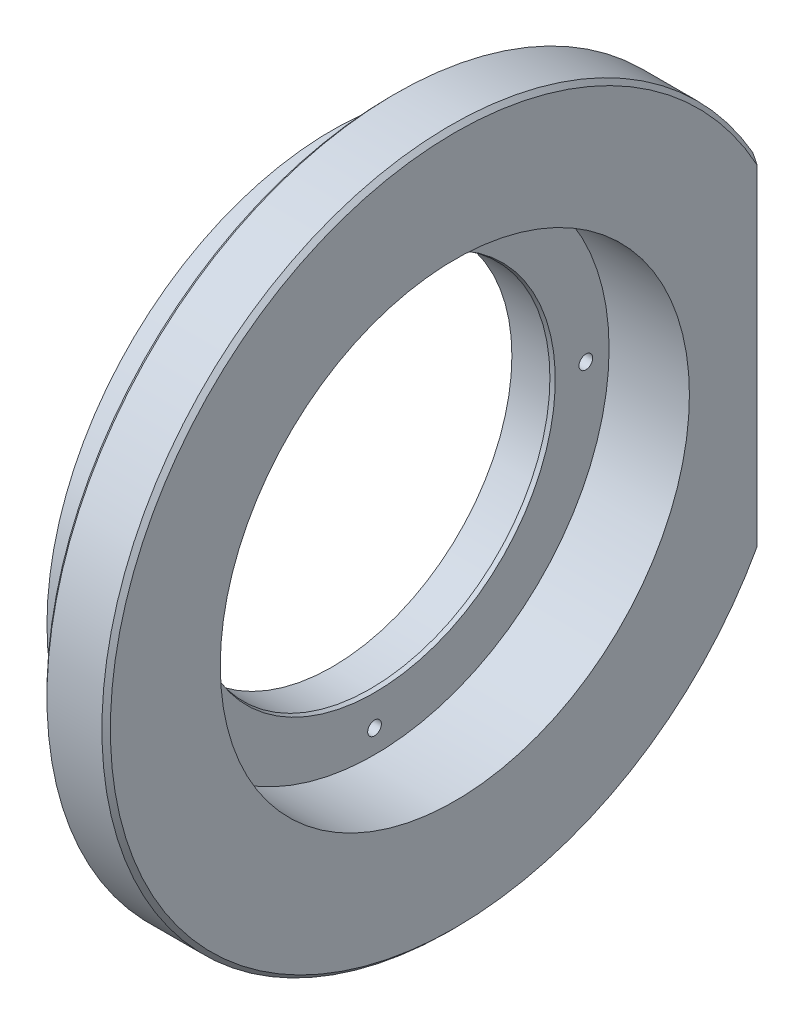
ISO-10303-21;
HEADER;
FILE_DESCRIPTION(('STEP AP214'),'2;1');
FILE_NAME('part.step','',(''),(''),'','','');
FILE_SCHEMA(('AUTOMOTIVE_DESIGN { 1 0 10303 214 1 1 1 1 }'));
ENDSEC;
DATA;
#1=APPLICATION_CONTEXT('core data for automotive mechanical design processes');
#2=APPLICATION_PROTOCOL_DEFINITION('international standard','automotive_design',2000,#1);
#3=PRODUCT_CONTEXT('',#1,'mechanical');
#4=PRODUCT('Part','Part','',(#3));
#5=PRODUCT_RELATED_PRODUCT_CATEGORY('part','',(#4));
#6=PRODUCT_DEFINITION_FORMATION('','',#4);
#7=PRODUCT_DEFINITION_CONTEXT('part definition',#1,'design');
#8=PRODUCT_DEFINITION('design','',#6,#7);
#9=PRODUCT_DEFINITION_SHAPE('','',#8);
#10=(LENGTH_UNIT() NAMED_UNIT(*) SI_UNIT(.MILLI.,.METRE.));
#11=(NAMED_UNIT(*) PLANE_ANGLE_UNIT() SI_UNIT($,.RADIAN.));
#12=(NAMED_UNIT(*) SI_UNIT($,.STERADIAN.) SOLID_ANGLE_UNIT());
#13=UNCERTAINTY_MEASURE_WITH_UNIT(LENGTH_MEASURE(1.E-05),#10,'distance_accuracy_value','');
#14=(GEOMETRIC_REPRESENTATION_CONTEXT(3) GLOBAL_UNCERTAINTY_ASSIGNED_CONTEXT((#13)) GLOBAL_UNIT_ASSIGNED_CONTEXT((#10,
#11,#12)) REPRESENTATION_CONTEXT('',''));
#15=CARTESIAN_POINT('',(0.,0.,0.));
#16=DIRECTION('',(0.,0.,1.));
#17=DIRECTION('',(1.,0.,0.));
#18=AXIS2_PLACEMENT_3D('',#15,#16,#17);
#19=CARTESIAN_POINT('',(140.,0.,0.));
#20=DIRECTION('',(-1.,0.,0.));
#21=DIRECTION('',(0.,0.,1.));
#22=AXIS2_PLACEMENT_3D('',#19,#20,#21);
#23=CYLINDRICAL_SURFACE('',#22,82.5);
#24=DIRECTION('',(-1.,0.,0.));
#25=VECTOR('',#24,1.);
#26=CARTESIAN_POINT('',(140.,-41.1582312545134,-71.5));
#27=LINE('',#26,#25);
#28=CARTESIAN_POINT('',(138.999999999102,-41.1582312545134,-71.5));
#29=VERTEX_POINT('',#28);
#30=CARTESIAN_POINT('',(125.999999999103,-41.1582312545134,-71.5));
#31=VERTEX_POINT('',#30);
#32=EDGE_CURVE('E147',#29,#31,#27,.T.);
#33=ORIENTED_EDGE('',*,*,#32,.F.);
#34=CARTESIAN_POINT('',(138.999999999102,0.,0.));
#35=DIRECTION('',(-1.,0.,0.));
#36=DIRECTION('',(0.,0.,1.));
#37=AXIS2_PLACEMENT_3D('',#34,#35,#36);
#38=CIRCLE('',#37,82.5);
#39=CARTESIAN_POINT('',(138.999999999102,41.1582312545134,-71.5));
#40=VERTEX_POINT('',#39);
#41=EDGE_CURVE('E154',#29,#40,#38,.T.);
#42=ORIENTED_EDGE('',*,*,#41,.T.);
#43=DIRECTION('',(-1.,0.,0.));
#44=VECTOR('',#43,1.);
#45=CARTESIAN_POINT('',(140.,41.1582312545134,-71.5));
#46=LINE('',#45,#44);
#47=CARTESIAN_POINT('',(125.999999999103,41.1582312545134,-71.5));
#48=VERTEX_POINT('',#47);
#49=EDGE_CURVE('E144',#40,#48,#46,.T.);
#50=ORIENTED_EDGE('',*,*,#49,.T.);
#51=CARTESIAN_POINT('',(125.999999999103,0.,0.));
#52=DIRECTION('',(-1.,0.,0.));
#53=DIRECTION('',(0.,0.,1.));
#54=AXIS2_PLACEMENT_3D('',#51,#52,#53);
#55=CIRCLE('',#54,82.5);
#56=EDGE_CURVE('E150',#48,#31,#55,.F.);
#57=ORIENTED_EDGE('',*,*,#56,.T.);
#58=EDGE_LOOP('',(#33,#42,#50,#57));
#59=FACE_BOUND('',#58,.T.);
#60=ADVANCED_FACE('F41',(#59),#23,.T.);
#61=CARTESIAN_POINT('',(140.,41.1582312545134,-71.5));
#62=DIRECTION('',(0.,0.,-1.));
#63=DIRECTION('',(-1.,0.,0.));
#64=AXIS2_PLACEMENT_3D('',#61,#62,#63);
#65=PLANE('',#64);
#66=ORIENTED_EDGE('',*,*,#49,.F.);
#67=CARTESIAN_POINT('',(138.999999999102,41.1582312545134,-71.5));
#68=CARTESIAN_POINT('',(139.169268794538,40.8190021582209,-71.5));
#69=CARTESIAN_POINT('',(139.33723651836,40.4791362235033,-71.5));
#70=CARTESIAN_POINT('',(139.670569852456,39.7981306165875,-71.5));
#71=CARTESIAN_POINT('',(139.835935462266,39.4569909441626,-71.5));
#72=CARTESIAN_POINT('',(140.,39.1152144330857,-71.5));
#73=B_SPLINE_CURVE_WITH_KNOTS('',3,(#67,#68,#69,#70,#71,#72),.UNSPECIFIED.,.F.,.F.,(4,2,4),(0.,
1.137320574178,2.27464135086772),.UNSPECIFIED.);
#74=CARTESIAN_POINT('',(140.,39.1152144330857,-71.5));
#75=VERTEX_POINT('',#74);
#76=EDGE_CURVE('E63',#40,#75,#73,.T.);
#77=ORIENTED_EDGE('',*,*,#76,.T.);
#78=DIRECTION('',(0.,-1.,0.));
#79=VECTOR('',#78,1.);
#80=CARTESIAN_POINT('',(140.,41.1582312545134,-71.5));
#81=LINE('',#80,#79);
#82=CARTESIAN_POINT('',(140.,-39.1152144330857,-71.5));
#83=VERTEX_POINT('',#82);
#84=EDGE_CURVE('E142',#75,#83,#81,.T.);
#85=ORIENTED_EDGE('',*,*,#84,.T.);
#86=CARTESIAN_POINT('',(140.,-39.1152144330857,-71.5));
#87=CARTESIAN_POINT('',(139.835935462266,-39.4569909441626,-71.5));
#88=CARTESIAN_POINT('',(139.670569852456,-39.7981306165875,-71.5));
#89=CARTESIAN_POINT('',(139.33723651836,-40.4791362235033,-71.5));
#90=CARTESIAN_POINT('',(139.169268794538,-40.8190021582209,-71.5));
#91=CARTESIAN_POINT('',(138.999999999102,-41.1582312545134,-71.5));
#92=B_SPLINE_CURVE_WITH_KNOTS('',3,(#86,#87,#88,#89,#90,#91),.UNSPECIFIED.,.F.,.F.,(4,2,4),(0.,
1.13732077668972,2.27464135086772),.UNSPECIFIED.);
#93=EDGE_CURVE('E191',#83,#29,#92,.T.);
#94=ORIENTED_EDGE('',*,*,#93,.T.);
#95=ORIENTED_EDGE('',*,*,#32,.T.);
#96=CARTESIAN_POINT('',(125.999999999103,-41.1582312545134,-71.5));
#97=CARTESIAN_POINT('',(125.830731203962,-40.819002157595,-71.5));
#98=CARTESIAN_POINT('',(125.662763480437,-40.4791362222527,-71.5));
#99=CARTESIAN_POINT('',(125.329430146939,-39.7981306140904,-71.5));
#100=CARTESIAN_POINT('',(125.164064537431,-39.4569909410435,-71.5));
#101=CARTESIAN_POINT('',(125.,-39.115214429346,-71.5));
#102=B_SPLINE_CURVE_WITH_KNOTS('',3,(#96,#97,#98,#99,#100,#101),.UNSPECIFIED.,.F.,.F.,(4,2,4),
(0.,1.13732057546287,2.27464135343747),.UNSPECIFIED.);
#103=CARTESIAN_POINT('',(125.,-39.115214429346,-71.5));
#104=VERTEX_POINT('',#103);
#105=EDGE_CURVE('E157',#31,#104,#102,.T.);
#106=ORIENTED_EDGE('',*,*,#105,.T.);
#107=DIRECTION('',(0.,-1.,0.));
#108=VECTOR('',#107,1.);
#109=CARTESIAN_POINT('',(125.,41.1582312545134,-71.5));
#110=LINE('',#109,#108);
#111=CARTESIAN_POINT('',(125.,39.115214429346,-71.5));
#112=VERTEX_POINT('',#111);
#113=EDGE_CURVE('E141',#112,#104,#110,.T.);
#114=ORIENTED_EDGE('',*,*,#113,.F.);
#115=CARTESIAN_POINT('',(125.,39.115214429346,-71.5));
#116=CARTESIAN_POINT('',(125.164064537431,39.4569909410435,-71.5));
#117=CARTESIAN_POINT('',(125.329430146939,39.7981306140904,-71.5));
#118=CARTESIAN_POINT('',(125.662763480437,40.4791362222527,-71.5));
#119=CARTESIAN_POINT('',(125.830731203962,40.819002157595,-71.5));
#120=CARTESIAN_POINT('',(125.999999999103,41.1582312545134,-71.5));
#121=B_SPLINE_CURVE_WITH_KNOTS('',3,(#115,#116,#117,#118,#119,#120),.UNSPECIFIED.,.F.,.F.,(4,2,
4),(0.,1.13732077797459,2.27464135343747),.UNSPECIFIED.);
#122=EDGE_CURVE('E164',#112,#48,#121,.T.);
#123=ORIENTED_EDGE('',*,*,#122,.T.);
#124=EDGE_LOOP('',(#66,#77,#85,#94,#95,#106,#114,#123));
#125=FACE_BOUND('',#124,.T.);
#126=ADVANCED_FACE('F170',(#125),#65,.T.);
#127=CARTESIAN_POINT('',(140.,0.,0.));
#128=DIRECTION('',(-1.,0.,0.));
#129=DIRECTION('',(0.,0.,1.));
#130=AXIS2_PLACEMENT_3D('',#127,#128,#129);
#131=PLANE('',#130);
#132=CARTESIAN_POINT('',(140.,0.,0.));
#133=DIRECTION('',(1.,0.,0.));
#134=DIRECTION('',(0.,0.,-1.));
#135=AXIS2_PLACEMENT_3D('',#132,#133,#134);
#136=CIRCLE('',#135,55.5);
#137=CARTESIAN_POINT('',(140.,0.,-55.5));
#138=VERTEX_POINT('',#137);
#139=EDGE_CURVE('E126',#138,#138,#136,.T.);
#140=ORIENTED_EDGE('',*,*,#139,.F.);
#141=EDGE_LOOP('',(#140));
#142=FACE_BOUND('',#141,.T.);
#143=ORIENTED_EDGE('',*,*,#84,.F.);
#144=CARTESIAN_POINT('',(140.,0.,0.));
#145=DIRECTION('',(-1.,0.,0.));
#146=DIRECTION('',(0.,0.,1.));
#147=AXIS2_PLACEMENT_3D('',#144,#145,#146);
#148=CIRCLE('',#147,81.5000000008974);
#149=EDGE_CURVE('E56',#75,#83,#148,.F.);
#150=ORIENTED_EDGE('',*,*,#149,.T.);
#151=EDGE_LOOP('',(#143,#150));
#152=FACE_BOUND('',#151,.T.);
#153=ADVANCED_FACE('F221',(#142,#152),#131,.F.);
#154=CARTESIAN_POINT('',(125.,0.,0.));
#155=DIRECTION('',(-1.,0.,0.));
#156=DIRECTION('',(0.,0.,1.));
#157=AXIS2_PLACEMENT_3D('',#154,#155,#156);
#158=PLANE('',#157);
#159=CARTESIAN_POINT('',(125.,0.,0.));
#160=DIRECTION('',(1.,0.,0.));
#161=DIRECTION('',(0.,0.,-1.));
#162=AXIS2_PLACEMENT_3D('',#159,#160,#161);
#163=CIRCLE('',#162,67.5);
#164=CARTESIAN_POINT('',(125.,0.,-67.5));
#165=VERTEX_POINT('',#164);
#166=EDGE_CURVE('E135',#165,#165,#163,.T.);
#167=ORIENTED_EDGE('',*,*,#166,.T.);
#168=EDGE_LOOP('',(#167));
#169=FACE_BOUND('',#168,.T.);
#170=ORIENTED_EDGE('',*,*,#113,.T.);
#171=CARTESIAN_POINT('',(125.,0.,0.));
#172=DIRECTION('',(-1.,0.,0.));
#173=DIRECTION('',(0.,0.,1.));
#174=AXIS2_PLACEMENT_3D('',#171,#172,#173);
#175=CIRCLE('',#174,81.4999999991026);
#176=EDGE_CURVE('E203',#104,#112,#175,.T.);
#177=ORIENTED_EDGE('',*,*,#176,.T.);
#178=EDGE_LOOP('',(#170,#177));
#179=FACE_BOUND('',#178,.T.);
#180=ADVANCED_FACE('F230',(#169,#179),#158,.T.);
#181=CARTESIAN_POINT('',(111.,0.,0.));
#182=DIRECTION('',(1.,0.,0.));
#183=DIRECTION('',(0.,0.,-1.));
#184=AXIS2_PLACEMENT_3D('',#181,#182,#183);
#185=CYLINDRICAL_SURFACE('',#184,67.5);
#186=CARTESIAN_POINT('',(111.,0.,0.));
#187=DIRECTION('',(1.,0.,0.));
#188=DIRECTION('',(0.,0.,-1.));
#189=AXIS2_PLACEMENT_3D('',#186,#187,#188);
#190=CIRCLE('',#189,67.5);
#191=CARTESIAN_POINT('',(111.,0.,-67.5));
#192=VERTEX_POINT('',#191);
#193=EDGE_CURVE('E138',#192,#192,#190,.T.);
#194=ORIENTED_EDGE('',*,*,#193,.T.);
#195=EDGE_LOOP('',(#194));
#196=FACE_BOUND('',#195,.T.);
#197=ORIENTED_EDGE('',*,*,#166,.F.);
#198=EDGE_LOOP('',(#197));
#199=FACE_BOUND('',#198,.T.);
#200=ADVANCED_FACE('F232',(#196,#199),#185,.T.);
#201=CARTESIAN_POINT('',(111.,67.5,0.));
#202=DIRECTION('',(-1.,0.,0.));
#203=DIRECTION('',(0.,0.,1.));
#204=AXIS2_PLACEMENT_3D('',#201,#202,#203);
#205=PLANE('',#204);
#206=CARTESIAN_POINT('',(111.,0.,0.));
#207=DIRECTION('',(1.,0.,0.));
#208=DIRECTION('',(0.,0.,-1.));
#209=AXIS2_PLACEMENT_3D('',#206,#207,#208);
#210=CIRCLE('',#209,42.5);
#211=CARTESIAN_POINT('',(111.,0.,-42.5));
#212=VERTEX_POINT('',#211);
#213=EDGE_CURVE('E132',#212,#212,#210,.T.);
#214=ORIENTED_EDGE('',*,*,#213,.T.);
#215=EDGE_LOOP('',(#214));
#216=FACE_BOUND('',#215,.T.);
#217=ORIENTED_EDGE('',*,*,#193,.F.);
#218=EDGE_LOOP('',(#217));
#219=FACE_BOUND('',#218,.T.);
#220=ADVANCED_FACE('F238',(#216,#219),#205,.T.);
#221=CARTESIAN_POINT('',(140.,0.,0.));
#222=DIRECTION('',(1.,0.,0.));
#223=DIRECTION('',(0.,0.,-1.));
#224=AXIS2_PLACEMENT_3D('',#221,#222,#223);
#225=CYLINDRICAL_SURFACE('',#224,42.5);
#226=CARTESIAN_POINT('',(119.99999999992,0.,0.));
#227=DIRECTION('',(-1.,0.,0.));
#228=DIRECTION('',(0.,0.,1.));
#229=AXIS2_PLACEMENT_3D('',#226,#227,#228);
#230=CIRCLE('',#229,42.5);
#231=CARTESIAN_POINT('',(119.99999999992,0.,42.5));
#232=VERTEX_POINT('',#231);
#233=EDGE_CURVE('E50',#232,#232,#230,.F.);
#234=ORIENTED_EDGE('',*,*,#233,.T.);
#235=EDGE_LOOP('',(#234));
#236=FACE_BOUND('',#235,.T.);
#237=ORIENTED_EDGE('',*,*,#213,.F.);
#238=EDGE_LOOP('',(#237));
#239=FACE_BOUND('',#238,.T.);
#240=ADVANCED_FACE('F208',(#236,#239),#225,.F.);
#241=CARTESIAN_POINT('',(121.,42.5,0.));
#242=DIRECTION('',(-1.,0.,0.));
#243=DIRECTION('',(0.,0.,1.));
#244=AXIS2_PLACEMENT_3D('',#241,#242,#243);
#245=PLANE('',#244);
#246=CARTESIAN_POINT('',(121.,0.,0.));
#247=DIRECTION('',(-1.,0.,0.));
#248=DIRECTION('',(0.,0.,1.));
#249=AXIS2_PLACEMENT_3D('',#246,#247,#248);
#250=CIRCLE('',#249,42.767949192132);
#251=CARTESIAN_POINT('',(121.,0.,42.767949192132));
#252=VERTEX_POINT('',#251);
#253=EDGE_CURVE('E11',#252,#252,#250,.T.);
#254=ORIENTED_EDGE('',*,*,#253,.T.);
#255=EDGE_LOOP('',(#254));
#256=FACE_BOUND('',#255,.T.);
#257=CARTESIAN_POINT('',(121.,50.,0.));
#258=DIRECTION('',(1.,0.,0.));
#259=DIRECTION('',(0.,0.,-1.));
#260=AXIS2_PLACEMENT_3D('',#257,#258,#259);
#261=CIRCLE('',#260,1.621);
#262=CARTESIAN_POINT('',(121.,50.,-1.621));
#263=VERTEX_POINT('',#262);
#264=EDGE_CURVE('E104',#263,#263,#261,.T.);
#265=ORIENTED_EDGE('',*,*,#264,.F.);
#266=EDGE_LOOP('',(#265));
#267=FACE_BOUND('',#266,.T.);
#268=CARTESIAN_POINT('',(121.,0.,50.));
#269=DIRECTION('',(1.,0.,0.));
#270=DIRECTION('',(0.,0.,-1.));
#271=AXIS2_PLACEMENT_3D('',#268,#269,#270);
#272=CIRCLE('',#271,1.621);
#273=CARTESIAN_POINT('',(121.,0.,48.379));
#274=VERTEX_POINT('',#273);
#275=EDGE_CURVE('E103',#274,#274,#272,.T.);
#276=ORIENTED_EDGE('',*,*,#275,.F.);
#277=EDGE_LOOP('',(#276));
#278=FACE_BOUND('',#277,.T.);
#279=CARTESIAN_POINT('',(121.,-50.,0.));
#280=DIRECTION('',(1.,0.,0.));
#281=DIRECTION('',(0.,0.,-1.));
#282=AXIS2_PLACEMENT_3D('',#279,#280,#281);
#283=CIRCLE('',#282,1.621);
#284=CARTESIAN_POINT('',(121.,-50.,-1.62099999999999));
#285=VERTEX_POINT('',#284);
#286=EDGE_CURVE('E114',#285,#285,#283,.T.);
#287=ORIENTED_EDGE('',*,*,#286,.F.);
#288=EDGE_LOOP('',(#287));
#289=FACE_BOUND('',#288,.T.);
#290=CARTESIAN_POINT('',(121.,0.,-50.));
#291=DIRECTION('',(1.,0.,0.));
#292=DIRECTION('',(0.,0.,-1.));
#293=AXIS2_PLACEMENT_3D('',#290,#291,#292);
#294=CIRCLE('',#293,1.621);
#295=CARTESIAN_POINT('',(121.,0.,-51.621));
#296=VERTEX_POINT('',#295);
#297=EDGE_CURVE('E120',#296,#296,#294,.T.);
#298=ORIENTED_EDGE('',*,*,#297,.F.);
#299=EDGE_LOOP('',(#298));
#300=FACE_BOUND('',#299,.T.);
#301=CARTESIAN_POINT('',(121.,0.,0.));
#302=DIRECTION('',(1.,0.,0.));
#303=DIRECTION('',(0.,0.,-1.));
#304=AXIS2_PLACEMENT_3D('',#301,#302,#303);
#305=CIRCLE('',#304,55.5);
#306=CARTESIAN_POINT('',(121.,0.,-55.5));
#307=VERTEX_POINT('',#306);
#308=EDGE_CURVE('E129',#307,#307,#305,.T.);
#309=ORIENTED_EDGE('',*,*,#308,.T.);
#310=EDGE_LOOP('',(#309));
#311=FACE_BOUND('',#310,.T.);
#312=ADVANCED_FACE('F249',(#256,#267,#278,#289,#300,#311),#245,.F.);
#313=CARTESIAN_POINT('',(140.,0.,0.));
#314=DIRECTION('',(1.,0.,0.));
#315=DIRECTION('',(0.,0.,-1.));
#316=AXIS2_PLACEMENT_3D('',#313,#314,#315);
#317=CYLINDRICAL_SURFACE('',#316,55.5);
#318=ORIENTED_EDGE('',*,*,#308,.F.);
#319=EDGE_LOOP('',(#318));
#320=FACE_BOUND('',#319,.T.);
#321=ORIENTED_EDGE('',*,*,#139,.T.);
#322=EDGE_LOOP('',(#321));
#323=FACE_BOUND('',#322,.T.);
#324=ADVANCED_FACE('F252',(#320,#323),#317,.F.);
#325=CARTESIAN_POINT('',(113.,0.,-50.));
#326=DIRECTION('',(1.,0.,0.));
#327=DIRECTION('',(0.,0.,-1.));
#328=AXIS2_PLACEMENT_3D('',#325,#326,#327);
#329=CONICAL_SURFACE('',#328,1.621,1.02974425747175);
#330=CARTESIAN_POINT('',(112.026004933898,0.,-50.));
#331=VERTEX_POINT('',#330);
#332=VERTEX_LOOP('',#331);
#333=FACE_BOUND('',#332,.T.);
#334=CARTESIAN_POINT('',(113.,0.,-50.));
#335=DIRECTION('',(1.,0.,0.));
#336=DIRECTION('',(0.,0.,-1.));
#337=AXIS2_PLACEMENT_3D('',#334,#335,#336);
#338=CIRCLE('',#337,1.621);
#339=CARTESIAN_POINT('',(113.,0.,-51.621));
#340=VERTEX_POINT('',#339);
#341=EDGE_CURVE('E123',#340,#340,#338,.T.);
#342=ORIENTED_EDGE('',*,*,#341,.T.);
#343=EDGE_LOOP('',(#342));
#344=FACE_BOUND('',#343,.T.);
#345=ADVANCED_FACE('F256',(#333,#344),#329,.F.);
#346=CARTESIAN_POINT('',(121.,0.,-50.));
#347=DIRECTION('',(1.,0.,0.));
#348=DIRECTION('',(0.,0.,-1.));
#349=AXIS2_PLACEMENT_3D('',#346,#347,#348);
#350=CYLINDRICAL_SURFACE('',#349,1.621);
#351=ORIENTED_EDGE('',*,*,#341,.F.);
#352=EDGE_LOOP('',(#351));
#353=FACE_BOUND('',#352,.T.);
#354=ORIENTED_EDGE('',*,*,#297,.T.);
#355=EDGE_LOOP('',(#354));
#356=FACE_BOUND('',#355,.T.);
#357=ADVANCED_FACE('F260',(#353,#356),#350,.F.);
#358=CARTESIAN_POINT('',(113.,-50.,0.));
#359=DIRECTION('',(1.,0.,0.));
#360=DIRECTION('',(0.,0.,-1.));
#361=AXIS2_PLACEMENT_3D('',#358,#359,#360);
#362=CONICAL_SURFACE('',#361,1.621,1.02974425747175);
#363=CARTESIAN_POINT('',(112.026004933898,-50.,0.));
#364=VERTEX_POINT('',#363);
#365=VERTEX_LOOP('',#364);
#366=FACE_BOUND('',#365,.T.);
#367=CARTESIAN_POINT('',(113.,-50.,0.));
#368=DIRECTION('',(1.,0.,0.));
#369=DIRECTION('',(0.,0.,-1.));
#370=AXIS2_PLACEMENT_3D('',#367,#368,#369);
#371=CIRCLE('',#370,1.621);
#372=CARTESIAN_POINT('',(113.,-50.,-1.62099999999999));
#373=VERTEX_POINT('',#372);
#374=EDGE_CURVE('E117',#373,#373,#371,.T.);
#375=ORIENTED_EDGE('',*,*,#374,.T.);
#376=EDGE_LOOP('',(#375));
#377=FACE_BOUND('',#376,.T.);
#378=ADVANCED_FACE('F264',(#366,#377),#362,.F.);
#379=CARTESIAN_POINT('',(121.,-50.,0.));
#380=DIRECTION('',(1.,0.,0.));
#381=DIRECTION('',(0.,0.,-1.));
#382=AXIS2_PLACEMENT_3D('',#379,#380,#381);
#383=CYLINDRICAL_SURFACE('',#382,1.621);
#384=ORIENTED_EDGE('',*,*,#374,.F.);
#385=EDGE_LOOP('',(#384));
#386=FACE_BOUND('',#385,.T.);
#387=ORIENTED_EDGE('',*,*,#286,.T.);
#388=EDGE_LOOP('',(#387));
#389=FACE_BOUND('',#388,.T.);
#390=ADVANCED_FACE('F268',(#386,#389),#383,.F.);
#391=CARTESIAN_POINT('',(113.,0.,50.));
#392=DIRECTION('',(1.,0.,0.));
#393=DIRECTION('',(0.,0.,-1.));
#394=AXIS2_PLACEMENT_3D('',#391,#392,#393);
#395=CONICAL_SURFACE('',#394,1.621,1.02974425747175);
#396=CARTESIAN_POINT('',(112.026004933898,0.,50.));
#397=VERTEX_POINT('',#396);
#398=VERTEX_LOOP('',#397);
#399=FACE_BOUND('',#398,.T.);
#400=CARTESIAN_POINT('',(113.,0.,50.));
#401=DIRECTION('',(1.,0.,0.));
#402=DIRECTION('',(0.,0.,-1.));
#403=AXIS2_PLACEMENT_3D('',#400,#401,#402);
#404=CIRCLE('',#403,1.621);
#405=CARTESIAN_POINT('',(113.,0.,48.379));
#406=VERTEX_POINT('',#405);
#407=EDGE_CURVE('E107',#406,#406,#404,.T.);
#408=ORIENTED_EDGE('',*,*,#407,.T.);
#409=EDGE_LOOP('',(#408));
#410=FACE_BOUND('',#409,.T.);
#411=ADVANCED_FACE('F272',(#399,#410),#395,.F.);
#412=CARTESIAN_POINT('',(121.,0.,50.));
#413=DIRECTION('',(1.,0.,0.));
#414=DIRECTION('',(0.,0.,-1.));
#415=AXIS2_PLACEMENT_3D('',#412,#413,#414);
#416=CYLINDRICAL_SURFACE('',#415,1.621);
#417=ORIENTED_EDGE('',*,*,#407,.F.);
#418=EDGE_LOOP('',(#417));
#419=FACE_BOUND('',#418,.T.);
#420=ORIENTED_EDGE('',*,*,#275,.T.);
#421=EDGE_LOOP('',(#420));
#422=FACE_BOUND('',#421,.T.);
#423=ADVANCED_FACE('F97',(#419,#422),#416,.F.);
#424=CARTESIAN_POINT('',(113.,50.,0.));
#425=DIRECTION('',(1.,0.,0.));
#426=DIRECTION('',(0.,0.,-1.));
#427=AXIS2_PLACEMENT_3D('',#424,#425,#426);
#428=CONICAL_SURFACE('',#427,1.621,1.02974425747175);
#429=CARTESIAN_POINT('',(112.026004933898,50.,0.));
#430=VERTEX_POINT('',#429);
#431=VERTEX_LOOP('',#430);
#432=FACE_BOUND('',#431,.T.);
#433=CARTESIAN_POINT('',(113.,50.,0.));
#434=DIRECTION('',(1.,0.,0.));
#435=DIRECTION('',(0.,0.,-1.));
#436=AXIS2_PLACEMENT_3D('',#433,#434,#435);
#437=CIRCLE('',#436,1.621);
#438=CARTESIAN_POINT('',(113.,50.,-1.621));
#439=VERTEX_POINT('',#438);
#440=EDGE_CURVE('E101',#439,#439,#437,.T.);
#441=ORIENTED_EDGE('',*,*,#440,.T.);
#442=EDGE_LOOP('',(#441));
#443=FACE_BOUND('',#442,.T.);
#444=ADVANCED_FACE('F93',(#432,#443),#428,.F.);
#445=CARTESIAN_POINT('',(121.,50.,0.));
#446=DIRECTION('',(1.,0.,0.));
#447=DIRECTION('',(0.,0.,-1.));
#448=AXIS2_PLACEMENT_3D('',#445,#446,#447);
#449=CYLINDRICAL_SURFACE('',#448,1.621);
#450=ORIENTED_EDGE('',*,*,#440,.F.);
#451=EDGE_LOOP('',(#450));
#452=FACE_BOUND('',#451,.T.);
#453=ORIENTED_EDGE('',*,*,#264,.T.);
#454=EDGE_LOOP('',(#453));
#455=FACE_BOUND('',#454,.T.);
#456=ADVANCED_FACE('F96',(#452,#455),#449,.F.);
#457=CARTESIAN_POINT('',(138.999999999102,0.,0.));
#458=DIRECTION('',(-1.,0.,0.));
#459=DIRECTION('',(0.,0.,1.));
#460=AXIS2_PLACEMENT_3D('',#457,#458,#459);
#461=CONICAL_SURFACE('',#460,82.5,0.785398162500013);
#462=ORIENTED_EDGE('',*,*,#93,.F.);
#463=ORIENTED_EDGE('',*,*,#149,.F.);
#464=ORIENTED_EDGE('',*,*,#76,.F.);
#465=ORIENTED_EDGE('',*,*,#41,.F.);
#466=EDGE_LOOP('',(#462,#463,#464,#465));
#467=FACE_BOUND('',#466,.T.);
#468=ADVANCED_FACE('F182',(#467),#461,.T.);
#469=CARTESIAN_POINT('',(125.,0.,0.));
#470=DIRECTION('',(1.,0.,0.));
#471=DIRECTION('',(0.,0.,-1.));
#472=AXIS2_PLACEMENT_3D('',#469,#470,#471);
#473=CONICAL_SURFACE('',#472,81.4999999991026,0.785398164294876);
#474=ORIENTED_EDGE('',*,*,#105,.F.);
#475=ORIENTED_EDGE('',*,*,#56,.F.);
#476=ORIENTED_EDGE('',*,*,#122,.F.);
#477=ORIENTED_EDGE('',*,*,#176,.F.);
#478=EDGE_LOOP('',(#474,#475,#476,#477));
#479=FACE_BOUND('',#478,.T.);
#480=ADVANCED_FACE('F175',(#479),#473,.T.);
#481=CARTESIAN_POINT('',(119.99999999992,0.,0.));
#482=DIRECTION('',(1.,0.,0.));
#483=DIRECTION('',(0.,0.,-1.));
#484=AXIS2_PLACEMENT_3D('',#481,#482,#483);
#485=CONICAL_SURFACE('',#484,42.5,0.261799387500021);
#486=ORIENTED_EDGE('',*,*,#253,.F.);
#487=EDGE_LOOP('',(#486));
#488=FACE_BOUND('',#487,.T.);
#489=ORIENTED_EDGE('',*,*,#233,.F.);
#490=EDGE_LOOP('',(#489));
#491=FACE_BOUND('',#490,.T.);
#492=ADVANCED_FACE('F44',(#488,#491),#485,.F.);
#493=CLOSED_SHELL('',(#60,#126,#153,#180,#200,#220,#240,#312,#324,#345,#357,#378,#390,#411,#423,
#444,#456,#468,#480,#492));
#494=MANIFOLD_SOLID_BREP('B2',#493);
#495=ADVANCED_BREP_SHAPE_REPRESENTATION('',(#18,#494),#14);
#496=SHAPE_DEFINITION_REPRESENTATION(#9,#495);
ENDSEC;
END-ISO-10303-21;
